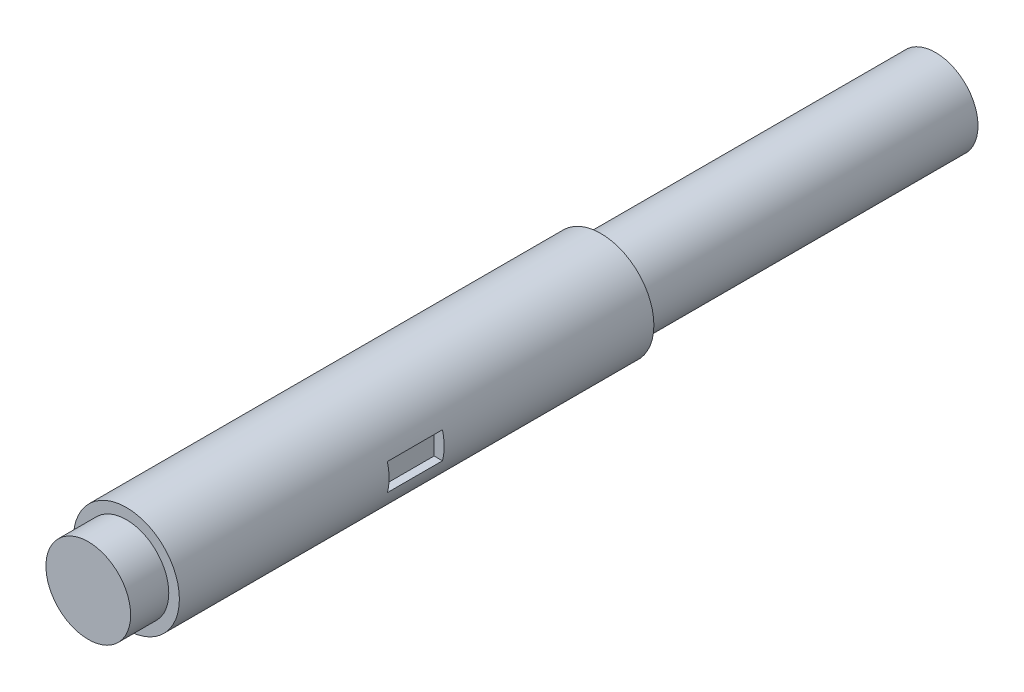
ISO-10303-21;
HEADER;
FILE_DESCRIPTION(('STEP AP214'),'2;1');
FILE_NAME('part.step','',(''),(''),'','','');
FILE_SCHEMA(('AUTOMOTIVE_DESIGN { 1 0 10303 214 1 1 1 1 }'));
ENDSEC;
DATA;
#1=APPLICATION_CONTEXT('core data for automotive mechanical design processes');
#2=APPLICATION_PROTOCOL_DEFINITION('international standard','automotive_design',2000,#1);
#3=PRODUCT_CONTEXT('',#1,'mechanical');
#4=PRODUCT('Part','Part','',(#3));
#5=PRODUCT_RELATED_PRODUCT_CATEGORY('part','',(#4));
#6=PRODUCT_DEFINITION_FORMATION('','',#4);
#7=PRODUCT_DEFINITION_CONTEXT('part definition',#1,'design');
#8=PRODUCT_DEFINITION('design','',#6,#7);
#9=PRODUCT_DEFINITION_SHAPE('','',#8);
#10=(LENGTH_UNIT() NAMED_UNIT(*) SI_UNIT(.MILLI.,.METRE.));
#11=(NAMED_UNIT(*) PLANE_ANGLE_UNIT() SI_UNIT($,.RADIAN.));
#12=(NAMED_UNIT(*) SI_UNIT($,.STERADIAN.) SOLID_ANGLE_UNIT());
#13=UNCERTAINTY_MEASURE_WITH_UNIT(LENGTH_MEASURE(1.E-05),#10,'distance_accuracy_value','');
#14=(GEOMETRIC_REPRESENTATION_CONTEXT(3) GLOBAL_UNCERTAINTY_ASSIGNED_CONTEXT((#13)) GLOBAL_UNIT_ASSIGNED_CONTEXT((#10,
#11,#12)) REPRESENTATION_CONTEXT('',''));
#15=CARTESIAN_POINT('',(0.,0.,0.));
#16=DIRECTION('',(0.,0.,1.));
#17=DIRECTION('',(1.,0.,0.));
#18=AXIS2_PLACEMENT_3D('',#15,#16,#17);
#19=CARTESIAN_POINT('',(0.,0.,0.));
#20=DIRECTION('',(0.,0.,1.));
#21=DIRECTION('',(1.,0.,0.));
#22=AXIS2_PLACEMENT_3D('',#19,#20,#21);
#23=PLANE('',#22);
#24=CARTESIAN_POINT('',(0.,0.,0.));
#25=DIRECTION('',(0.,0.,1.));
#26=DIRECTION('',(1.,0.,0.));
#27=AXIS2_PLACEMENT_3D('',#24,#25,#26);
#28=CIRCLE('',#27,12.5);
#29=CARTESIAN_POINT('',(12.5,0.,0.));
#30=VERTEX_POINT('',#29);
#31=EDGE_CURVE('E110',#30,#30,#28,.T.);
#32=ORIENTED_EDGE('',*,*,#31,.F.);
#33=EDGE_LOOP('',(#32));
#34=FACE_BOUND('',#33,.T.);
#35=CARTESIAN_POINT('',(0.,0.,0.));
#36=DIRECTION('',(0.,0.,1.));
#37=DIRECTION('',(1.,0.,0.));
#38=AXIS2_PLACEMENT_3D('',#35,#36,#37);
#39=CIRCLE('',#38,10.);
#40=CARTESIAN_POINT('',(10.,0.,0.));
#41=VERTEX_POINT('',#40);
#42=EDGE_CURVE('E116',#41,#41,#39,.F.);
#43=ORIENTED_EDGE('',*,*,#42,.F.);
#44=EDGE_LOOP('',(#43));
#45=FACE_BOUND('',#44,.T.);
#46=ADVANCED_FACE('F33',(#34,#45),#23,.F.);
#47=CARTESIAN_POINT('',(0.,0.,112.));
#48=DIRECTION('',(0.,0.,1.));
#49=DIRECTION('',(1.,0.,0.));
#50=AXIS2_PLACEMENT_3D('',#47,#48,#49);
#51=PLANE('',#50);
#52=CARTESIAN_POINT('',(0.,0.,112.));
#53=DIRECTION('',(0.,0.,1.));
#54=DIRECTION('',(1.,0.,0.));
#55=AXIS2_PLACEMENT_3D('',#52,#53,#54);
#56=CIRCLE('',#55,12.5);
#57=CARTESIAN_POINT('',(12.5,0.,112.));
#58=VERTEX_POINT('',#57);
#59=EDGE_CURVE('E113',#58,#58,#56,.T.);
#60=ORIENTED_EDGE('',*,*,#59,.T.);
#61=EDGE_LOOP('',(#60));
#62=FACE_BOUND('',#61,.T.);
#63=CARTESIAN_POINT('',(0.,0.,112.));
#64=DIRECTION('',(0.,0.,1.));
#65=DIRECTION('',(1.,0.,0.));
#66=AXIS2_PLACEMENT_3D('',#63,#64,#65);
#67=CIRCLE('',#66,10.);
#68=CARTESIAN_POINT('',(10.,0.,112.));
#69=VERTEX_POINT('',#68);
#70=EDGE_CURVE('E103',#69,#69,#67,.T.);
#71=ORIENTED_EDGE('',*,*,#70,.F.);
#72=EDGE_LOOP('',(#71));
#73=FACE_BOUND('',#72,.T.);
#74=ADVANCED_FACE('F139',(#62,#73),#51,.T.);
#75=CARTESIAN_POINT('',(0.,0.,112.));
#76=DIRECTION('',(0.,0.,-1.));
#77=DIRECTION('',(-1.,0.,0.));
#78=AXIS2_PLACEMENT_3D('',#75,#76,#77);
#79=CYLINDRICAL_SURFACE('',#78,12.5);
#80=CARTESIAN_POINT('',(0.,0.,62.5));
#81=DIRECTION('',(0.,0.,1.));
#82=DIRECTION('',(1.,0.,0.));
#83=AXIS2_PLACEMENT_3D('',#80,#81,#82);
#84=CIRCLE('',#83,12.5);
#85=CARTESIAN_POINT('',(12.0900527294135,-3.175,62.5));
#86=VERTEX_POINT('',#85);
#87=CARTESIAN_POINT('',(12.0900527294136,3.175,62.5));
#88=VERTEX_POINT('',#87);
#89=EDGE_CURVE('E121',#86,#88,#84,.T.);
#90=ORIENTED_EDGE('',*,*,#89,.T.);
#91=DIRECTION('',(0.,0.,-1.));
#92=VECTOR('',#91,1.);
#93=CARTESIAN_POINT('',(12.0900527294136,3.17499999999999,112.));
#94=LINE('',#93,#92);
#95=CARTESIAN_POINT('',(12.0900527294135,3.175,49.5));
#96=VERTEX_POINT('',#95);
#97=EDGE_CURVE('E11',#88,#96,#94,.T.);
#98=ORIENTED_EDGE('',*,*,#97,.T.);
#99=CARTESIAN_POINT('',(0.,0.,49.5));
#100=DIRECTION('',(0.,0.,-1.));
#101=DIRECTION('',(-1.,0.,0.));
#102=AXIS2_PLACEMENT_3D('',#99,#100,#101);
#103=CIRCLE('',#102,12.5);
#104=CARTESIAN_POINT('',(12.0900527294135,-3.175,49.5));
#105=VERTEX_POINT('',#104);
#106=EDGE_CURVE('E41',#96,#105,#103,.T.);
#107=ORIENTED_EDGE('',*,*,#106,.T.);
#108=DIRECTION('',(0.,0.,-1.));
#109=VECTOR('',#108,1.);
#110=CARTESIAN_POINT('',(12.0900527294135,-3.17500000000001,112.));
#111=LINE('',#110,#109);
#112=EDGE_CURVE('E55',#105,#86,#111,.F.);
#113=ORIENTED_EDGE('',*,*,#112,.T.);
#114=EDGE_LOOP('',(#90,#98,#107,#113));
#115=FACE_BOUND('',#114,.T.);
#116=ORIENTED_EDGE('',*,*,#59,.F.);
#117=EDGE_LOOP('',(#116));
#118=FACE_BOUND('',#117,.T.);
#119=ORIENTED_EDGE('',*,*,#31,.T.);
#120=EDGE_LOOP('',(#119));
#121=FACE_BOUND('',#120,.T.);
#122=ADVANCED_FACE('F35',(#115,#118,#121),#79,.T.);
#123=CARTESIAN_POINT('',(0.,0.,121.));
#124=DIRECTION('',(0.,0.,-1.));
#125=DIRECTION('',(-1.,0.,0.));
#126=AXIS2_PLACEMENT_3D('',#123,#124,#125);
#127=CYLINDRICAL_SURFACE('',#126,10.);
#128=CARTESIAN_POINT('',(0.,0.,121.));
#129=DIRECTION('',(0.,0.,1.));
#130=DIRECTION('',(1.,0.,0.));
#131=AXIS2_PLACEMENT_3D('',#128,#129,#130);
#132=CIRCLE('',#131,10.);
#133=CARTESIAN_POINT('',(10.,0.,121.));
#134=VERTEX_POINT('',#133);
#135=EDGE_CURVE('E107',#134,#134,#132,.T.);
#136=ORIENTED_EDGE('',*,*,#135,.F.);
#137=EDGE_LOOP('',(#136));
#138=FACE_BOUND('',#137,.T.);
#139=ORIENTED_EDGE('',*,*,#70,.T.);
#140=EDGE_LOOP('',(#139));
#141=FACE_BOUND('',#140,.T.);
#142=ADVANCED_FACE('F149',(#138,#141),#127,.T.);
#143=CARTESIAN_POINT('',(0.,0.,121.));
#144=DIRECTION('',(0.,0.,1.));
#145=DIRECTION('',(1.,0.,0.));
#146=AXIS2_PLACEMENT_3D('',#143,#144,#145);
#147=PLANE('',#146);
#148=ORIENTED_EDGE('',*,*,#135,.T.);
#149=EDGE_LOOP('',(#148));
#150=FACE_BOUND('',#149,.T.);
#151=ADVANCED_FACE('F152',(#150),#147,.T.);
#152=CARTESIAN_POINT('',(0.,0.,-9.));
#153=DIRECTION('',(0.,0.,1.));
#154=DIRECTION('',(1.,0.,0.));
#155=AXIS2_PLACEMENT_3D('',#152,#153,#154);
#156=CYLINDRICAL_SURFACE('',#155,10.);
#157=ORIENTED_EDGE('',*,*,#42,.T.);
#158=EDGE_LOOP('',(#157));
#159=FACE_BOUND('',#158,.T.);
#160=CARTESIAN_POINT('',(0.,0.,-79.));
#161=DIRECTION('',(0.,0.,-1.));
#162=DIRECTION('',(-1.,0.,0.));
#163=AXIS2_PLACEMENT_3D('',#160,#161,#162);
#164=CIRCLE('',#163,10.);
#165=CARTESIAN_POINT('',(-10.,0.,-79.));
#166=VERTEX_POINT('',#165);
#167=EDGE_CURVE('E94',#166,#166,#164,.T.);
#168=ORIENTED_EDGE('',*,*,#167,.F.);
#169=EDGE_LOOP('',(#168));
#170=FACE_BOUND('',#169,.T.);
#171=ADVANCED_FACE('F135',(#159,#170),#156,.T.);
#172=CARTESIAN_POINT('',(10.11875,3.175,49.5));
#173=DIRECTION('',(0.,0.,-1.));
#174=DIRECTION('',(-1.,0.,0.));
#175=AXIS2_PLACEMENT_3D('',#172,#173,#174);
#176=PLANE('',#175);
#177=DIRECTION('',(1.,0.,0.));
#178=VECTOR('',#177,1.);
#179=CARTESIAN_POINT('',(10.11875,3.175,49.5));
#180=LINE('',#179,#178);
#181=CARTESIAN_POINT('',(10.11875,3.175,49.5));
#182=VERTEX_POINT('',#181);
#183=EDGE_CURVE('E72',#182,#96,#180,.T.);
#184=ORIENTED_EDGE('',*,*,#183,.F.);
#185=DIRECTION('',(0.,1.,0.));
#186=VECTOR('',#185,1.);
#187=CARTESIAN_POINT('',(10.11875,3.175,49.5));
#188=LINE('',#187,#186);
#189=CARTESIAN_POINT('',(10.11875,-3.175,49.5));
#190=VERTEX_POINT('',#189);
#191=EDGE_CURVE('E76',#190,#182,#188,.T.);
#192=ORIENTED_EDGE('',*,*,#191,.F.);
#193=DIRECTION('',(1.,0.,0.));
#194=VECTOR('',#193,1.);
#195=CARTESIAN_POINT('',(10.11875,-3.175,49.5));
#196=LINE('',#195,#194);
#197=EDGE_CURVE('E101',#190,#105,#196,.T.);
#198=ORIENTED_EDGE('',*,*,#197,.T.);
#199=ORIENTED_EDGE('',*,*,#106,.F.);
#200=EDGE_LOOP('',(#184,#192,#198,#199));
#201=FACE_BOUND('',#200,.T.);
#202=ADVANCED_FACE('F74',(#201),#176,.F.);
#203=CARTESIAN_POINT('',(10.11875,-3.175,49.5));
#204=DIRECTION('',(0.,-1.,0.));
#205=DIRECTION('',(0.,0.,-1.));
#206=AXIS2_PLACEMENT_3D('',#203,#204,#205);
#207=PLANE('',#206);
#208=ORIENTED_EDGE('',*,*,#197,.F.);
#209=DIRECTION('',(0.,0.,-1.));
#210=VECTOR('',#209,1.);
#211=CARTESIAN_POINT('',(10.11875,-3.175,49.5));
#212=LINE('',#211,#210);
#213=CARTESIAN_POINT('',(10.11875,-3.175,62.5));
#214=VERTEX_POINT('',#213);
#215=EDGE_CURVE('E81',#214,#190,#212,.T.);
#216=ORIENTED_EDGE('',*,*,#215,.F.);
#217=DIRECTION('',(1.,0.,0.));
#218=VECTOR('',#217,1.);
#219=CARTESIAN_POINT('',(10.11875,-3.175,62.5));
#220=LINE('',#219,#218);
#221=EDGE_CURVE('E104',#214,#86,#220,.T.);
#222=ORIENTED_EDGE('',*,*,#221,.T.);
#223=ORIENTED_EDGE('',*,*,#112,.F.);
#224=EDGE_LOOP('',(#208,#216,#222,#223));
#225=FACE_BOUND('',#224,.T.);
#226=ADVANCED_FACE('F127',(#225),#207,.F.);
#227=CARTESIAN_POINT('',(10.11875,3.175,62.5));
#228=DIRECTION('',(0.,0.,1.));
#229=DIRECTION('',(1.,0.,0.));
#230=AXIS2_PLACEMENT_3D('',#227,#228,#229);
#231=PLANE('',#230);
#232=ORIENTED_EDGE('',*,*,#89,.F.);
#233=ORIENTED_EDGE('',*,*,#221,.F.);
#234=DIRECTION('',(0.,-1.,0.));
#235=VECTOR('',#234,1.);
#236=CARTESIAN_POINT('',(10.11875,3.175,62.5));
#237=LINE('',#236,#235);
#238=CARTESIAN_POINT('',(10.11875,3.175,62.5));
#239=VERTEX_POINT('',#238);
#240=EDGE_CURVE('E90',#239,#214,#237,.T.);
#241=ORIENTED_EDGE('',*,*,#240,.F.);
#242=DIRECTION('',(1.,0.,0.));
#243=VECTOR('',#242,1.);
#244=CARTESIAN_POINT('',(10.11875,3.175,62.5));
#245=LINE('',#244,#243);
#246=EDGE_CURVE('E80',#239,#88,#245,.T.);
#247=ORIENTED_EDGE('',*,*,#246,.T.);
#248=EDGE_LOOP('',(#232,#233,#241,#247));
#249=FACE_BOUND('',#248,.T.);
#250=ADVANCED_FACE('F126',(#249),#231,.F.);
#251=CARTESIAN_POINT('',(10.11875,3.175,49.5));
#252=DIRECTION('',(0.,1.,0.));
#253=DIRECTION('',(0.,0.,1.));
#254=AXIS2_PLACEMENT_3D('',#251,#252,#253);
#255=PLANE('',#254);
#256=ORIENTED_EDGE('',*,*,#246,.F.);
#257=DIRECTION('',(0.,0.,1.));
#258=VECTOR('',#257,1.);
#259=CARTESIAN_POINT('',(10.11875,3.175,49.5));
#260=LINE('',#259,#258);
#261=EDGE_CURVE('E84',#182,#239,#260,.T.);
#262=ORIENTED_EDGE('',*,*,#261,.F.);
#263=ORIENTED_EDGE('',*,*,#183,.T.);
#264=ORIENTED_EDGE('',*,*,#97,.F.);
#265=EDGE_LOOP('',(#256,#262,#263,#264));
#266=FACE_BOUND('',#265,.T.);
#267=ADVANCED_FACE('F85',(#266),#255,.F.);
#268=CARTESIAN_POINT('',(10.11875,0.,0.));
#269=DIRECTION('',(-1.,0.,0.));
#270=DIRECTION('',(0.,0.,1.));
#271=AXIS2_PLACEMENT_3D('',#268,#269,#270);
#272=PLANE('',#271);
#273=ORIENTED_EDGE('',*,*,#191,.T.);
#274=ORIENTED_EDGE('',*,*,#261,.T.);
#275=ORIENTED_EDGE('',*,*,#240,.T.);
#276=ORIENTED_EDGE('',*,*,#215,.T.);
#277=EDGE_LOOP('',(#273,#274,#275,#276));
#278=FACE_BOUND('',#277,.T.);
#279=ADVANCED_FACE('F92',(#278),#272,.F.);
#280=CARTESIAN_POINT('',(0.,0.,-79.));
#281=DIRECTION('',(0.,0.,-1.));
#282=DIRECTION('',(-1.,0.,0.));
#283=AXIS2_PLACEMENT_3D('',#280,#281,#282);
#284=PLANE('',#283);
#285=ORIENTED_EDGE('',*,*,#167,.T.);
#286=EDGE_LOOP('',(#285));
#287=FACE_BOUND('',#286,.T.);
#288=ADVANCED_FACE('F164',(#287),#284,.T.);
#289=CLOSED_SHELL('',(#46,#74,#122,#142,#151,#171,#202,#226,#250,#267,#279,#288));
#290=MANIFOLD_SOLID_BREP('B2',#289);
#291=ADVANCED_BREP_SHAPE_REPRESENTATION('',(#18,#290),#14);
#292=SHAPE_DEFINITION_REPRESENTATION(#9,#291);
ENDSEC;
END-ISO-10303-21;
